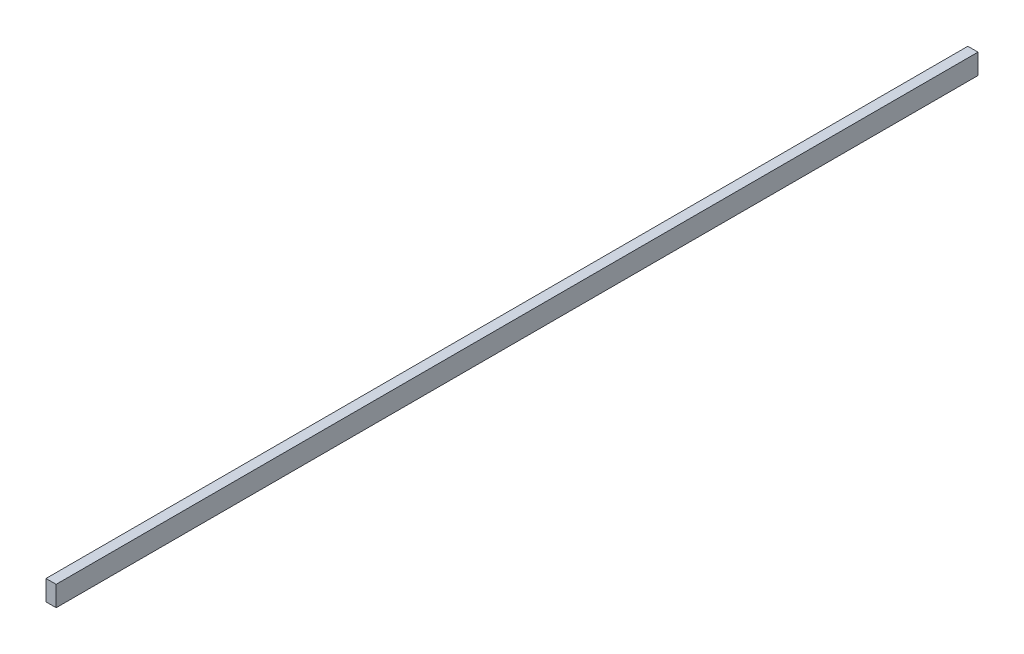
ISO-10303-21;
HEADER;
FILE_DESCRIPTION(('STEP AP214'),'2;1');
FILE_NAME('part.step','',(''),(''),'','','');
FILE_SCHEMA(('AUTOMOTIVE_DESIGN { 1 0 10303 214 1 1 1 1 }'));
ENDSEC;
DATA;
#1=APPLICATION_CONTEXT('core data for automotive mechanical design processes');
#2=APPLICATION_PROTOCOL_DEFINITION('international standard','automotive_design',2000,#1);
#3=PRODUCT_CONTEXT('',#1,'mechanical');
#4=PRODUCT('Part','Part','',(#3));
#5=PRODUCT_RELATED_PRODUCT_CATEGORY('part','',(#4));
#6=PRODUCT_DEFINITION_FORMATION('','',#4);
#7=PRODUCT_DEFINITION_CONTEXT('part definition',#1,'design');
#8=PRODUCT_DEFINITION('design','',#6,#7);
#9=PRODUCT_DEFINITION_SHAPE('','',#8);
#10=(LENGTH_UNIT() NAMED_UNIT(*) SI_UNIT(.MILLI.,.METRE.));
#11=(NAMED_UNIT(*) PLANE_ANGLE_UNIT() SI_UNIT($,.RADIAN.));
#12=(NAMED_UNIT(*) SI_UNIT($,.STERADIAN.) SOLID_ANGLE_UNIT());
#13=UNCERTAINTY_MEASURE_WITH_UNIT(LENGTH_MEASURE(1.E-05),#10,'distance_accuracy_value','');
#14=(GEOMETRIC_REPRESENTATION_CONTEXT(3) GLOBAL_UNCERTAINTY_ASSIGNED_CONTEXT((#13)) GLOBAL_UNIT_ASSIGNED_CONTEXT((#10,
#11,#12)) REPRESENTATION_CONTEXT('',''));
#15=CARTESIAN_POINT('',(0.,0.,0.));
#16=DIRECTION('',(0.,0.,1.));
#17=DIRECTION('',(1.,0.,0.));
#18=AXIS2_PLACEMENT_3D('',#15,#16,#17);
#19=CARTESIAN_POINT('',(0.,0.,288.29));
#20=DIRECTION('',(1.,0.,0.));
#21=DIRECTION('',(0.,0.,-1.));
#22=AXIS2_PLACEMENT_3D('',#19,#20,#21);
#23=PLANE('',#22);
#24=DIRECTION('',(0.,-1.,0.));
#25=VECTOR('',#24,1.);
#26=CARTESIAN_POINT('',(0.,0.,0.));
#27=LINE('',#26,#25);
#28=CARTESIAN_POINT('',(0.,6.35,0.));
#29=VERTEX_POINT('',#28);
#30=CARTESIAN_POINT('',(0.,0.,0.));
#31=VERTEX_POINT('',#30);
#32=EDGE_CURVE('E107',#29,#31,#27,.T.);
#33=ORIENTED_EDGE('',*,*,#32,.T.);
#34=DIRECTION('',(0.,0.,-1.));
#35=VECTOR('',#34,1.);
#36=CARTESIAN_POINT('',(0.,0.,288.29));
#37=LINE('',#36,#35);
#38=CARTESIAN_POINT('',(0.,0.,288.29));
#39=VERTEX_POINT('',#38);
#40=EDGE_CURVE('E11',#39,#31,#37,.T.);
#41=ORIENTED_EDGE('',*,*,#40,.F.);
#42=DIRECTION('',(0.,-1.,0.));
#43=VECTOR('',#42,1.);
#44=CARTESIAN_POINT('',(0.,0.,288.29));
#45=LINE('',#44,#43);
#46=CARTESIAN_POINT('',(0.,6.35,288.29));
#47=VERTEX_POINT('',#46);
#48=EDGE_CURVE('E91',#47,#39,#45,.T.);
#49=ORIENTED_EDGE('',*,*,#48,.F.);
#50=DIRECTION('',(0.,0.,-1.));
#51=VECTOR('',#50,1.);
#52=CARTESIAN_POINT('',(0.,6.35,288.29));
#53=LINE('',#52,#51);
#54=EDGE_CURVE('E103',#47,#29,#53,.T.);
#55=ORIENTED_EDGE('',*,*,#54,.T.);
#56=EDGE_LOOP('',(#33,#41,#49,#55));
#57=FACE_BOUND('',#56,.T.);
#58=ADVANCED_FACE('F39',(#57),#23,.F.);
#59=CARTESIAN_POINT('',(0.,0.,288.29));
#60=DIRECTION('',(0.,1.,0.));
#61=DIRECTION('',(0.,0.,1.));
#62=AXIS2_PLACEMENT_3D('',#59,#60,#61);
#63=PLANE('',#62);
#64=DIRECTION('',(1.,0.,0.));
#65=VECTOR('',#64,1.);
#66=CARTESIAN_POINT('',(0.,0.,0.));
#67=LINE('',#66,#65);
#68=CARTESIAN_POINT('',(3.175,0.,0.));
#69=VERTEX_POINT('',#68);
#70=EDGE_CURVE('E96',#31,#69,#67,.T.);
#71=ORIENTED_EDGE('',*,*,#70,.T.);
#72=DIRECTION('',(0.,0.,-1.));
#73=VECTOR('',#72,1.);
#74=CARTESIAN_POINT('',(3.175,0.,288.29));
#75=LINE('',#74,#73);
#76=CARTESIAN_POINT('',(3.175,0.,288.29));
#77=VERTEX_POINT('',#76);
#78=EDGE_CURVE('E48',#77,#69,#75,.T.);
#79=ORIENTED_EDGE('',*,*,#78,.F.);
#80=DIRECTION('',(1.,0.,0.));
#81=VECTOR('',#80,1.);
#82=CARTESIAN_POINT('',(0.,0.,288.29));
#83=LINE('',#82,#81);
#84=EDGE_CURVE('E86',#39,#77,#83,.T.);
#85=ORIENTED_EDGE('',*,*,#84,.F.);
#86=ORIENTED_EDGE('',*,*,#40,.T.);
#87=EDGE_LOOP('',(#71,#79,#85,#86));
#88=FACE_BOUND('',#87,.T.);
#89=ADVANCED_FACE('F95',(#88),#63,.F.);
#90=CARTESIAN_POINT('',(3.175,0.,288.29));
#91=DIRECTION('',(-1.,0.,0.));
#92=DIRECTION('',(0.,0.,1.));
#93=AXIS2_PLACEMENT_3D('',#90,#91,#92);
#94=PLANE('',#93);
#95=DIRECTION('',(0.,1.,0.));
#96=VECTOR('',#95,1.);
#97=CARTESIAN_POINT('',(3.175,0.,0.));
#98=LINE('',#97,#96);
#99=CARTESIAN_POINT('',(3.175,6.35,0.));
#100=VERTEX_POINT('',#99);
#101=EDGE_CURVE('E73',#69,#100,#98,.T.);
#102=ORIENTED_EDGE('',*,*,#101,.T.);
#103=DIRECTION('',(0.,0.,-1.));
#104=VECTOR('',#103,1.);
#105=CARTESIAN_POINT('',(3.175,6.35,288.29));
#106=LINE('',#105,#104);
#107=CARTESIAN_POINT('',(3.175,6.35,288.29));
#108=VERTEX_POINT('',#107);
#109=EDGE_CURVE('E98',#108,#100,#106,.T.);
#110=ORIENTED_EDGE('',*,*,#109,.F.);
#111=DIRECTION('',(0.,1.,0.));
#112=VECTOR('',#111,1.);
#113=CARTESIAN_POINT('',(3.175,0.,288.29));
#114=LINE('',#113,#112);
#115=EDGE_CURVE('E89',#77,#108,#114,.T.);
#116=ORIENTED_EDGE('',*,*,#115,.F.);
#117=ORIENTED_EDGE('',*,*,#78,.T.);
#118=EDGE_LOOP('',(#102,#110,#116,#117));
#119=FACE_BOUND('',#118,.T.);
#120=ADVANCED_FACE('F99',(#119),#94,.F.);
#121=CARTESIAN_POINT('',(0.,6.35,288.29));
#122=DIRECTION('',(0.,-1.,0.));
#123=DIRECTION('',(0.,0.,-1.));
#124=AXIS2_PLACEMENT_3D('',#121,#122,#123);
#125=PLANE('',#124);
#126=DIRECTION('',(-1.,0.,0.));
#127=VECTOR('',#126,1.);
#128=CARTESIAN_POINT('',(0.,6.35,0.));
#129=LINE('',#128,#127);
#130=EDGE_CURVE('E79',#100,#29,#129,.T.);
#131=ORIENTED_EDGE('',*,*,#130,.T.);
#132=ORIENTED_EDGE('',*,*,#54,.F.);
#133=DIRECTION('',(-1.,0.,0.));
#134=VECTOR('',#133,1.);
#135=CARTESIAN_POINT('',(0.,6.35,288.29));
#136=LINE('',#135,#134);
#137=EDGE_CURVE('E56',#108,#47,#136,.T.);
#138=ORIENTED_EDGE('',*,*,#137,.F.);
#139=ORIENTED_EDGE('',*,*,#109,.T.);
#140=EDGE_LOOP('',(#131,#132,#138,#139));
#141=FACE_BOUND('',#140,.T.);
#142=ADVANCED_FACE('F120',(#141),#125,.F.);
#143=CARTESIAN_POINT('',(0.,0.,288.29));
#144=DIRECTION('',(0.,0.,-1.));
#145=DIRECTION('',(-1.,0.,0.));
#146=AXIS2_PLACEMENT_3D('',#143,#144,#145);
#147=PLANE('',#146);
#148=ORIENTED_EDGE('',*,*,#48,.T.);
#149=ORIENTED_EDGE('',*,*,#84,.T.);
#150=ORIENTED_EDGE('',*,*,#115,.T.);
#151=ORIENTED_EDGE('',*,*,#137,.T.);
#152=EDGE_LOOP('',(#148,#149,#150,#151));
#153=FACE_BOUND('',#152,.T.);
#154=ADVANCED_FACE('F87',(#153),#147,.F.);
#155=CARTESIAN_POINT('',(0.,0.,0.));
#156=DIRECTION('',(0.,0.,-1.));
#157=DIRECTION('',(-1.,0.,0.));
#158=AXIS2_PLACEMENT_3D('',#155,#156,#157);
#159=PLANE('',#158);
#160=ORIENTED_EDGE('',*,*,#32,.F.);
#161=ORIENTED_EDGE('',*,*,#130,.F.);
#162=ORIENTED_EDGE('',*,*,#101,.F.);
#163=ORIENTED_EDGE('',*,*,#70,.F.);
#164=EDGE_LOOP('',(#160,#161,#162,#163));
#165=FACE_BOUND('',#164,.T.);
#166=ADVANCED_FACE('F123',(#165),#159,.T.);
#167=CLOSED_SHELL('',(#58,#89,#120,#142,#154,#166));
#168=MANIFOLD_SOLID_BREP('B2',#167);
#169=ADVANCED_BREP_SHAPE_REPRESENTATION('',(#18,#168),#14);
#170=SHAPE_DEFINITION_REPRESENTATION(#9,#169);
ENDSEC;
END-ISO-10303-21;
